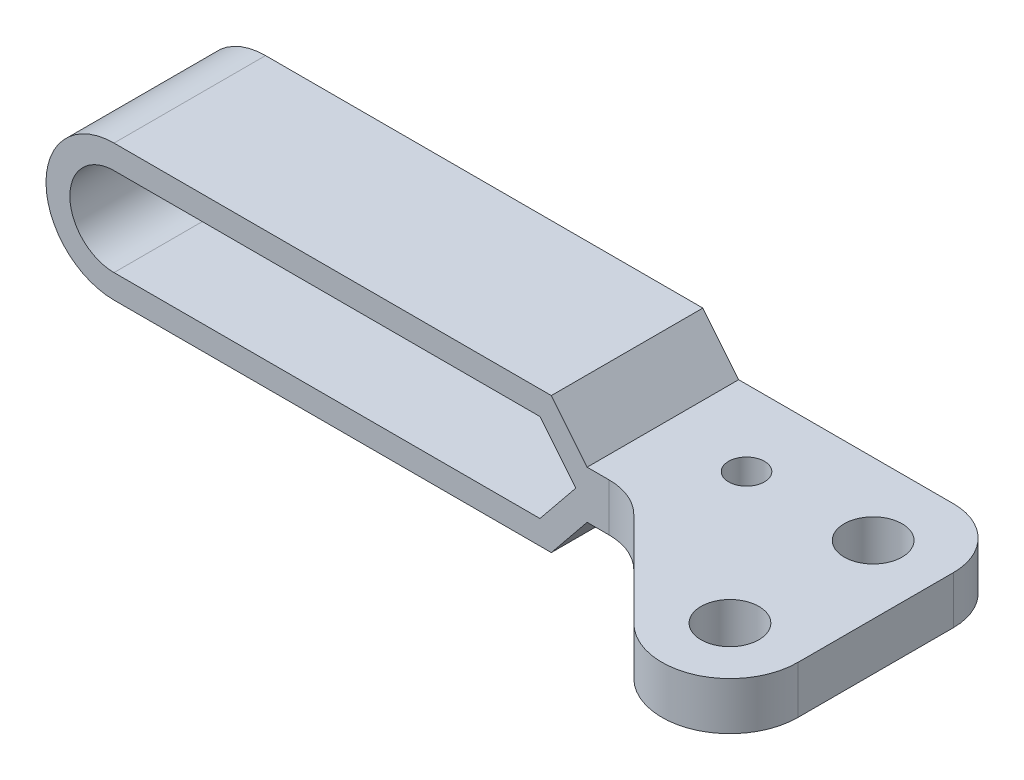
ISO-10303-21;
HEADER;
FILE_DESCRIPTION(('STEP AP214'),'2;1');
FILE_NAME('part.step','',(''),(''),'','','');
FILE_SCHEMA(('AUTOMOTIVE_DESIGN { 1 0 10303 214 1 1 1 1 }'));
ENDSEC;
DATA;
#1=APPLICATION_CONTEXT('core data for automotive mechanical design processes');
#2=APPLICATION_PROTOCOL_DEFINITION('international standard','automotive_design',2000,#1);
#3=PRODUCT_CONTEXT('',#1,'mechanical');
#4=PRODUCT('Part','Part','',(#3));
#5=PRODUCT_RELATED_PRODUCT_CATEGORY('part','',(#4));
#6=PRODUCT_DEFINITION_FORMATION('','',#4);
#7=PRODUCT_DEFINITION_CONTEXT('part definition',#1,'design');
#8=PRODUCT_DEFINITION('design','',#6,#7);
#9=PRODUCT_DEFINITION_SHAPE('','',#8);
#10=(LENGTH_UNIT() NAMED_UNIT(*) SI_UNIT(.MILLI.,.METRE.));
#11=(NAMED_UNIT(*) PLANE_ANGLE_UNIT() SI_UNIT($,.RADIAN.));
#12=(NAMED_UNIT(*) SI_UNIT($,.STERADIAN.) SOLID_ANGLE_UNIT());
#13=UNCERTAINTY_MEASURE_WITH_UNIT(LENGTH_MEASURE(1.E-05),#10,'distance_accuracy_value','');
#14=(GEOMETRIC_REPRESENTATION_CONTEXT(3) GLOBAL_UNCERTAINTY_ASSIGNED_CONTEXT((#13)) GLOBAL_UNIT_ASSIGNED_CONTEXT((#10,
#11,#12)) REPRESENTATION_CONTEXT('',''));
#15=CARTESIAN_POINT('',(0.,0.,0.));
#16=DIRECTION('',(0.,0.,1.));
#17=DIRECTION('',(1.,0.,0.));
#18=AXIS2_PLACEMENT_3D('',#15,#16,#17);
#19=CARTESIAN_POINT('',(-62.65,5.7,12.7));
#20=DIRECTION('',(0.,-1.,0.));
#21=DIRECTION('',(0.,0.,-1.));
#22=AXIS2_PLACEMENT_3D('',#19,#20,#21);
#23=PLANE('',#22);
#24=DIRECTION('',(0.,0.,-1.));
#25=VECTOR('',#24,1.);
#26=CARTESIAN_POINT('',(-26.,5.7,6.35));
#27=LINE('',#26,#25);
#28=CARTESIAN_POINT('',(-25.9999999933277,5.7,12.7));
#29=VERTEX_POINT('',#28);
#30=CARTESIAN_POINT('',(-26.,5.7,0.));
#31=VERTEX_POINT('',#30);
#32=EDGE_CURVE('E219',#29,#31,#27,.T.);
#33=ORIENTED_EDGE('',*,*,#32,.T.);
#34=DIRECTION('',(-1.,0.,0.));
#35=VECTOR('',#34,1.);
#36=CARTESIAN_POINT('',(-36.86505,5.7,0.));
#37=LINE('',#36,#35);
#38=CARTESIAN_POINT('',(-62.6499999994154,5.7,0.));
#39=VERTEX_POINT('',#38);
#40=EDGE_CURVE('E212',#31,#39,#37,.T.);
#41=ORIENTED_EDGE('',*,*,#40,.T.);
#42=DIRECTION('',(0.,0.,-1.));
#43=VECTOR('',#42,1.);
#44=CARTESIAN_POINT('',(-62.6499999988309,5.7,6.35));
#45=LINE('',#44,#43);
#46=CARTESIAN_POINT('',(-62.6499999994154,5.7,12.7));
#47=VERTEX_POINT('',#46);
#48=EDGE_CURVE('E237',#39,#47,#45,.F.);
#49=ORIENTED_EDGE('',*,*,#48,.T.);
#50=DIRECTION('',(-1.,0.,0.));
#51=VECTOR('',#50,1.);
#52=CARTESIAN_POINT('',(-44.897606303,5.7,12.7));
#53=LINE('',#52,#51);
#54=EDGE_CURVE('E183',#29,#47,#53,.T.);
#55=ORIENTED_EDGE('',*,*,#54,.F.);
#56=EDGE_LOOP('',(#33,#41,#49,#55));
#57=FACE_BOUND('',#56,.T.);
#58=ADVANCED_FACE('F16',(#57),#23,.F.);
#59=CARTESIAN_POINT('',(-62.65,0.,12.7));
#60=DIRECTION('',(0.,0.,-1.));
#61=DIRECTION('',(-1.,0.,0.));
#62=AXIS2_PLACEMENT_3D('',#59,#60,#61);
#63=CYLINDRICAL_SURFACE('',#62,5.7);
#64=CARTESIAN_POINT('',(-62.65,0.,12.7));
#65=DIRECTION('',(0.,0.,-1.));
#66=DIRECTION('',(-1.,0.,0.));
#67=AXIS2_PLACEMENT_3D('',#64,#65,#66);
#68=CIRCLE('',#67,5.7);
#69=CARTESIAN_POINT('',(-62.65,-5.7,12.7));
#70=VERTEX_POINT('',#69);
#71=EDGE_CURVE('E182',#47,#70,#68,.F.);
#72=ORIENTED_EDGE('',*,*,#71,.F.);
#73=ORIENTED_EDGE('',*,*,#48,.F.);
#74=CARTESIAN_POINT('',(-62.65,0.,0.));
#75=DIRECTION('',(0.,0.,-1.));
#76=DIRECTION('',(-1.,0.,0.));
#77=AXIS2_PLACEMENT_3D('',#74,#75,#76);
#78=CIRCLE('',#77,5.7);
#79=CARTESIAN_POINT('',(-62.65,-5.7,0.));
#80=VERTEX_POINT('',#79);
#81=EDGE_CURVE('E209',#39,#80,#78,.F.);
#82=ORIENTED_EDGE('',*,*,#81,.T.);
#83=DIRECTION('',(0.,0.,1.));
#84=VECTOR('',#83,1.);
#85=CARTESIAN_POINT('',(-62.65,-5.7,6.35));
#86=LINE('',#85,#84);
#87=EDGE_CURVE('E232',#80,#70,#86,.T.);
#88=ORIENTED_EDGE('',*,*,#87,.T.);
#89=EDGE_LOOP('',(#72,#73,#82,#88));
#90=FACE_BOUND('',#89,.T.);
#91=ADVANCED_FACE('F286',(#90),#63,.T.);
#92=CARTESIAN_POINT('',(-62.65,-5.7,0.));
#93=DIRECTION('',(0.,1.,0.));
#94=DIRECTION('',(0.,0.,1.));
#95=AXIS2_PLACEMENT_3D('',#92,#93,#94);
#96=PLANE('',#95);
#97=ORIENTED_EDGE('',*,*,#87,.F.);
#98=DIRECTION('',(1.,0.,0.));
#99=VECTOR('',#98,1.);
#100=CARTESIAN_POINT('',(-36.86505,-5.7,0.));
#101=LINE('',#100,#99);
#102=CARTESIAN_POINT('',(-26.0000000009042,-5.7,0.));
#103=VERTEX_POINT('',#102);
#104=EDGE_CURVE('E206',#80,#103,#101,.T.);
#105=ORIENTED_EDGE('',*,*,#104,.T.);
#106=DIRECTION('',(0.,0.,1.));
#107=VECTOR('',#106,1.);
#108=CARTESIAN_POINT('',(-26.,-5.7,6.35));
#109=LINE('',#108,#107);
#110=CARTESIAN_POINT('',(-25.9999999933277,-5.7,12.7));
#111=VERTEX_POINT('',#110);
#112=EDGE_CURVE('E195',#103,#111,#109,.T.);
#113=ORIENTED_EDGE('',*,*,#112,.T.);
#114=DIRECTION('',(1.,0.,0.));
#115=VECTOR('',#114,1.);
#116=CARTESIAN_POINT('',(-44.897606303,-5.7,12.7));
#117=LINE('',#116,#115);
#118=EDGE_CURVE('E179',#70,#111,#117,.T.);
#119=ORIENTED_EDGE('',*,*,#118,.F.);
#120=EDGE_LOOP('',(#97,#105,#113,#119));
#121=FACE_BOUND('',#120,.T.);
#122=ADVANCED_FACE('F291',(#121),#96,.F.);
#123=CARTESIAN_POINT('',(-62.65,3.7,0.));
#124=DIRECTION('',(0.,-1.,0.));
#125=DIRECTION('',(1.,0.,0.));
#126=AXIS2_PLACEMENT_3D('',#123,#124,#125);
#127=PLANE('',#126);
#128=DIRECTION('',(0.,0.,-1.));
#129=VECTOR('',#128,1.);
#130=CARTESIAN_POINT('',(-62.6499999992411,3.69999999999999,6.35));
#131=LINE('',#130,#129);
#132=CARTESIAN_POINT('',(-62.6499999996206,3.7000000028,0.));
#133=VERTEX_POINT('',#132);
#134=CARTESIAN_POINT('',(-62.6499999996206,3.7000000028,12.7));
#135=VERTEX_POINT('',#134);
#136=EDGE_CURVE('E216',#133,#135,#131,.F.);
#137=ORIENTED_EDGE('',*,*,#136,.F.);
#138=DIRECTION('',(1.,0.,0.));
#139=VECTOR('',#138,1.);
#140=CARTESIAN_POINT('',(-36.86505,3.7000000056,0.));
#141=LINE('',#140,#139);
#142=CARTESIAN_POINT('',(-26.9531903512703,3.7000000028,0.));
#143=VERTEX_POINT('',#142);
#144=EDGE_CURVE('E203',#133,#143,#141,.T.);
#145=ORIENTED_EDGE('',*,*,#144,.T.);
#146=DIRECTION('',(0.,0.,-1.));
#147=VECTOR('',#146,1.);
#148=CARTESIAN_POINT('',(-26.953190349,3.7,6.35));
#149=LINE('',#148,#147);
#150=CARTESIAN_POINT('',(-26.9531903580785,3.7000000042,12.7));
#151=VERTEX_POINT('',#150);
#152=EDGE_CURVE('E229',#151,#143,#149,.T.);
#153=ORIENTED_EDGE('',*,*,#152,.F.);
#154=DIRECTION('',(1.,0.,0.));
#155=VECTOR('',#154,1.);
#156=CARTESIAN_POINT('',(-44.897606303,3.7000000056,12.7));
#157=LINE('',#156,#155);
#158=EDGE_CURVE('E174',#135,#151,#157,.T.);
#159=ORIENTED_EDGE('',*,*,#158,.F.);
#160=EDGE_LOOP('',(#137,#145,#153,#159));
#161=FACE_BOUND('',#160,.T.);
#162=ADVANCED_FACE('F374',(#161),#127,.T.);
#163=CARTESIAN_POINT('',(-26.953190349,3.7,0.));
#164=DIRECTION('',(-0.776755748719504,-0.629801958421219,0.));
#165=DIRECTION('',(0.629801958421219,-0.776755748719504,0.));
#166=AXIS2_PLACEMENT_3D('',#163,#164,#165);
#167=PLANE('',#166);
#168=ORIENTED_EDGE('',*,*,#152,.T.);
#169=DIRECTION('',(0.629801958421219,-0.776755748719504,0.));
#170=VECTOR('',#169,1.);
#171=CARTESIAN_POINT('',(-26.953190349,3.7,0.));
#172=LINE('',#171,#170);
#173=CARTESIAN_POINT('',(-23.953190349,0.,0.));
#174=VERTEX_POINT('',#173);
#175=EDGE_CURVE('E205',#143,#174,#172,.T.);
#176=ORIENTED_EDGE('',*,*,#175,.T.);
#177=DIRECTION('',(0.,0.,-1.));
#178=VECTOR('',#177,1.);
#179=CARTESIAN_POINT('',(-23.953190349,0.,6.35));
#180=LINE('',#179,#178);
#181=CARTESIAN_POINT('',(-23.9531903435565,1.022902421868E-09,12.7));
#182=VERTEX_POINT('',#181);
#183=EDGE_CURVE('E226',#182,#174,#180,.T.);
#184=ORIENTED_EDGE('',*,*,#183,.F.);
#185=DIRECTION('',(0.629801961205317,-0.776755746462127,0.));
#186=VECTOR('',#185,1.);
#187=CARTESIAN_POINT('',(-26.953190367157,3.7000000056,12.7));
#188=LINE('',#187,#186);
#189=EDGE_CURVE('E177',#151,#182,#188,.T.);
#190=ORIENTED_EDGE('',*,*,#189,.F.);
#191=EDGE_LOOP('',(#168,#176,#184,#190));
#192=FACE_BOUND('',#191,.T.);
#193=ADVANCED_FACE('F377',(#192),#167,.T.);
#194=CARTESIAN_POINT('',(-23.953190349,0.,0.));
#195=DIRECTION('',(-0.776755748719504,0.629801958421219,0.));
#196=DIRECTION('',(-0.629801958421219,-0.776755748719504,0.));
#197=AXIS2_PLACEMENT_3D('',#194,#195,#196);
#198=PLANE('',#197);
#199=ORIENTED_EDGE('',*,*,#183,.T.);
#200=DIRECTION('',(-0.629801958421219,-0.776755748719504,0.));
#201=VECTOR('',#200,1.);
#202=CARTESIAN_POINT('',(-23.953190349,0.,0.));
#203=LINE('',#202,#201);
#204=CARTESIAN_POINT('',(-26.9531903512703,-3.7000000028,0.));
#205=VERTEX_POINT('',#204);
#206=EDGE_CURVE('E202',#174,#205,#203,.T.);
#207=ORIENTED_EDGE('',*,*,#206,.T.);
#208=DIRECTION('',(0.,0.,-1.));
#209=VECTOR('',#208,1.);
#210=CARTESIAN_POINT('',(-26.953190349,-3.7,6.35));
#211=LINE('',#210,#209);
#212=CARTESIAN_POINT('',(-26.9531903580785,-3.7000000042,12.7));
#213=VERTEX_POINT('',#212);
#214=EDGE_CURVE('E223',#213,#205,#211,.T.);
#215=ORIENTED_EDGE('',*,*,#214,.F.);
#216=DIRECTION('',(-0.629801961205317,-0.776755746462127,0.));
#217=VECTOR('',#216,1.);
#218=CARTESIAN_POINT('',(-23.9531903406362,0.,12.7));
#219=LINE('',#218,#217);
#220=EDGE_CURVE('E173',#182,#213,#219,.T.);
#221=ORIENTED_EDGE('',*,*,#220,.F.);
#222=EDGE_LOOP('',(#199,#207,#215,#221));
#223=FACE_BOUND('',#222,.T.);
#224=ADVANCED_FACE('F381',(#223),#198,.T.);
#225=CARTESIAN_POINT('',(-26.953190349,-3.7,0.));
#226=DIRECTION('',(0.,1.,0.));
#227=DIRECTION('',(-1.,0.,0.));
#228=AXIS2_PLACEMENT_3D('',#225,#226,#227);
#229=PLANE('',#228);
#230=ORIENTED_EDGE('',*,*,#214,.T.);
#231=DIRECTION('',(-1.,0.,0.));
#232=VECTOR('',#231,1.);
#233=CARTESIAN_POINT('',(-36.86505,-3.7000000056,0.));
#234=LINE('',#233,#232);
#235=CARTESIAN_POINT('',(-62.6499999992883,-3.7000000028,0.));
#236=VERTEX_POINT('',#235);
#237=EDGE_CURVE('E199',#205,#236,#234,.T.);
#238=ORIENTED_EDGE('',*,*,#237,.T.);
#239=DIRECTION('',(0.,0.,1.));
#240=VECTOR('',#239,1.);
#241=CARTESIAN_POINT('',(-62.6499999985766,-3.69999999999999,6.35));
#242=LINE('',#241,#240);
#243=CARTESIAN_POINT('',(-62.6499999992883,-3.7000000028,12.7));
#244=VERTEX_POINT('',#243);
#245=EDGE_CURVE('E220',#244,#236,#242,.F.);
#246=ORIENTED_EDGE('',*,*,#245,.F.);
#247=DIRECTION('',(-1.,0.,0.));
#248=VECTOR('',#247,1.);
#249=CARTESIAN_POINT('',(-44.897606303,-3.7000000056,12.7));
#250=LINE('',#249,#248);
#251=EDGE_CURVE('E170',#213,#244,#250,.T.);
#252=ORIENTED_EDGE('',*,*,#251,.F.);
#253=EDGE_LOOP('',(#230,#238,#246,#252));
#254=FACE_BOUND('',#253,.T.);
#255=ADVANCED_FACE('F339',(#254),#229,.T.);
#256=CARTESIAN_POINT('',(-62.65,0.,12.7));
#257=DIRECTION('',(0.,0.,-1.));
#258=DIRECTION('',(-1.,0.,0.));
#259=AXIS2_PLACEMENT_3D('',#256,#257,#258);
#260=CYLINDRICAL_SURFACE('',#259,3.69999999999999);
#261=CARTESIAN_POINT('',(-62.65,0.,0.));
#262=DIRECTION('',(0.,0.,-1.));
#263=DIRECTION('',(-1.,0.,0.));
#264=AXIS2_PLACEMENT_3D('',#261,#262,#263);
#265=CIRCLE('',#264,3.69999999999999);
#266=EDGE_CURVE('E196',#236,#133,#265,.T.);
#267=ORIENTED_EDGE('',*,*,#266,.T.);
#268=ORIENTED_EDGE('',*,*,#136,.T.);
#269=CARTESIAN_POINT('',(-62.65,0.,12.7));
#270=DIRECTION('',(0.,0.,-1.));
#271=DIRECTION('',(-1.,0.,0.));
#272=AXIS2_PLACEMENT_3D('',#269,#270,#271);
#273=CIRCLE('',#272,3.69999999999999);
#274=EDGE_CURVE('E169',#244,#135,#273,.T.);
#275=ORIENTED_EDGE('',*,*,#274,.F.);
#276=ORIENTED_EDGE('',*,*,#245,.T.);
#277=EDGE_LOOP('',(#267,#268,#275,#276));
#278=FACE_BOUND('',#277,.T.);
#279=ADVANCED_FACE('F330',(#278),#260,.F.);
#280=CARTESIAN_POINT('',(-26.,5.7,0.));
#281=DIRECTION('',(-0.776755748719503,-0.62980195842122,0.));
#282=DIRECTION('',(0.62980195842122,-0.776755748719503,0.));
#283=AXIS2_PLACEMENT_3D('',#280,#281,#282);
#284=PLANE('',#283);
#285=DIRECTION('',(0.,0.,-1.));
#286=VECTOR('',#285,1.);
#287=CARTESIAN_POINT('',(-23.,2.,11.93619));
#288=LINE('',#287,#286);
#289=CARTESIAN_POINT('',(-23.0000000060731,2.,12.6999999996446));
#290=VERTEX_POINT('',#289);
#291=CARTESIAN_POINT('',(-23.,2.,0.));
#292=VERTEX_POINT('',#291);
#293=EDGE_CURVE('E109',#290,#292,#288,.T.);
#294=ORIENTED_EDGE('',*,*,#293,.T.);
#295=DIRECTION('',(0.62980195842122,-0.776755748719503,0.));
#296=VECTOR('',#295,1.);
#297=CARTESIAN_POINT('',(-26.,5.7,0.));
#298=LINE('',#297,#296);
#299=EDGE_CURVE('E20',#292,#31,#298,.F.);
#300=ORIENTED_EDGE('',*,*,#299,.T.);
#301=ORIENTED_EDGE('',*,*,#32,.F.);
#302=DIRECTION('',(-0.629801955192465,0.776755751337413,0.));
#303=VECTOR('',#302,1.);
#304=CARTESIAN_POINT('',(-23.0000000076056,1.9999999944,12.7));
#305=LINE('',#304,#303);
#306=EDGE_CURVE('E186',#290,#29,#305,.T.);
#307=ORIENTED_EDGE('',*,*,#306,.F.);
#308=EDGE_LOOP('',(#294,#300,#301,#307));
#309=FACE_BOUND('',#308,.T.);
#310=ADVANCED_FACE('F328',(#309),#284,.F.);
#311=CARTESIAN_POINT('',(-68.7301,-5.7,0.));
#312=DIRECTION('',(0.,0.,1.));
#313=DIRECTION('',(1.,0.,0.));
#314=AXIS2_PLACEMENT_3D('',#311,#312,#313);
#315=PLANE('',#314);
#316=ORIENTED_EDGE('',*,*,#266,.F.);
#317=ORIENTED_EDGE('',*,*,#237,.F.);
#318=ORIENTED_EDGE('',*,*,#206,.F.);
#319=ORIENTED_EDGE('',*,*,#175,.F.);
#320=ORIENTED_EDGE('',*,*,#144,.F.);
#321=EDGE_LOOP('',(#316,#317,#318,#319,#320));
#322=FACE_BOUND('',#321,.T.);
#323=DIRECTION('',(-1.,0.,0.));
#324=VECTOR('',#323,1.);
#325=CARTESIAN_POINT('',(-11.5,-2.,0.));
#326=LINE('',#325,#324);
#327=CARTESIAN_POINT('',(-5.00000000102552,-2.,0.));
#328=VERTEX_POINT('',#327);
#329=CARTESIAN_POINT('',(-23.,-2.,0.));
#330=VERTEX_POINT('',#329);
#331=EDGE_CURVE('E164',#328,#330,#326,.T.);
#332=ORIENTED_EDGE('',*,*,#331,.T.);
#333=DIRECTION('',(-0.62980195842122,-0.776755748719503,0.));
#334=VECTOR('',#333,1.);
#335=CARTESIAN_POINT('',(-24.5,-3.85,0.));
#336=LINE('',#335,#334);
#337=EDGE_CURVE('E192',#330,#103,#336,.T.);
#338=ORIENTED_EDGE('',*,*,#337,.T.);
#339=ORIENTED_EDGE('',*,*,#104,.F.);
#340=ORIENTED_EDGE('',*,*,#81,.F.);
#341=ORIENTED_EDGE('',*,*,#40,.F.);
#342=ORIENTED_EDGE('',*,*,#299,.F.);
#343=DIRECTION('',(1.,0.,0.));
#344=VECTOR('',#343,1.);
#345=CARTESIAN_POINT('',(-11.5,2.,0.));
#346=LINE('',#345,#344);
#347=CARTESIAN_POINT('',(-5.00000000102552,2.,0.));
#348=VERTEX_POINT('',#347);
#349=EDGE_CURVE('E117',#292,#348,#346,.T.);
#350=ORIENTED_EDGE('',*,*,#349,.T.);
#351=DIRECTION('',(0.,1.,0.));
#352=VECTOR('',#351,1.);
#353=CARTESIAN_POINT('',(-5.00000000205103,0.,0.));
#354=LINE('',#353,#352);
#355=EDGE_CURVE('E141',#348,#328,#354,.F.);
#356=ORIENTED_EDGE('',*,*,#355,.T.);
#357=EDGE_LOOP('',(#332,#338,#339,#340,#341,#342,#350,#356));
#358=FACE_BOUND('',#357,.T.);
#359=ADVANCED_FACE('F293',(#322,#358),#315,.F.);
#360=CARTESIAN_POINT('',(-23.,-2.,0.));
#361=DIRECTION('',(-0.776755748719503,0.62980195842122,0.));
#362=DIRECTION('',(-0.62980195842122,-0.776755748719503,0.));
#363=AXIS2_PLACEMENT_3D('',#360,#361,#362);
#364=PLANE('',#363);
#365=ORIENTED_EDGE('',*,*,#112,.F.);
#366=ORIENTED_EDGE('',*,*,#337,.F.);
#367=DIRECTION('',(0.,0.,1.));
#368=VECTOR('',#367,1.);
#369=CARTESIAN_POINT('',(-23.,-2.,11.93619));
#370=LINE('',#369,#368);
#371=CARTESIAN_POINT('',(-23.0000000060731,-2.,12.6999999996446));
#372=VERTEX_POINT('',#371);
#373=EDGE_CURVE('E187',#330,#372,#370,.T.);
#374=ORIENTED_EDGE('',*,*,#373,.T.);
#375=DIRECTION('',(0.629801955192465,0.776755751337413,0.));
#376=VECTOR('',#375,1.);
#377=CARTESIAN_POINT('',(-25.9999999866553,-5.7,12.7));
#378=LINE('',#377,#376);
#379=EDGE_CURVE('E178',#111,#372,#378,.T.);
#380=ORIENTED_EDGE('',*,*,#379,.F.);
#381=EDGE_LOOP('',(#365,#366,#374,#380));
#382=FACE_BOUND('',#381,.T.);
#383=ADVANCED_FACE('F301',(#382),#364,.F.);
#384=CARTESIAN_POINT('',(-68.633127489,-5.7,12.7));
#385=DIRECTION('',(0.,0.,1.));
#386=DIRECTION('',(1.,0.,0.));
#387=AXIS2_PLACEMENT_3D('',#384,#385,#386);
#388=PLANE('',#387);
#389=ORIENTED_EDGE('',*,*,#251,.T.);
#390=ORIENTED_EDGE('',*,*,#274,.T.);
#391=ORIENTED_EDGE('',*,*,#158,.T.);
#392=ORIENTED_EDGE('',*,*,#189,.T.);
#393=ORIENTED_EDGE('',*,*,#220,.T.);
#394=EDGE_LOOP('',(#389,#390,#391,#392,#393));
#395=FACE_BOUND('',#394,.T.);
#396=DIRECTION('',(1.,0.,0.));
#397=VECTOR('',#396,1.);
#398=CARTESIAN_POINT('',(-11.5,-2.,12.6999999995261));
#399=LINE('',#398,#397);
#400=CARTESIAN_POINT('',(-21.1620851180255,-2.,12.6999999997631));
#401=VERTEX_POINT('',#400);
#402=EDGE_CURVE('E189',#372,#401,#399,.T.);
#403=ORIENTED_EDGE('',*,*,#402,.T.);
#404=DIRECTION('',(0.,1.,0.));
#405=VECTOR('',#404,1.);
#406=CARTESIAN_POINT('',(-21.162085119051,0.,12.7));
#407=LINE('',#406,#405);
#408=CARTESIAN_POINT('',(-21.1620851180255,2.,12.6999999997631));
#409=VERTEX_POINT('',#408);
#410=EDGE_CURVE('E161',#409,#401,#407,.F.);
#411=ORIENTED_EDGE('',*,*,#410,.F.);
#412=DIRECTION('',(-1.,0.,0.));
#413=VECTOR('',#412,1.);
#414=CARTESIAN_POINT('',(-11.5,2.,12.6999999995261));
#415=LINE('',#414,#413);
#416=EDGE_CURVE('E159',#409,#290,#415,.T.);
#417=ORIENTED_EDGE('',*,*,#416,.T.);
#418=ORIENTED_EDGE('',*,*,#306,.T.);
#419=ORIENTED_EDGE('',*,*,#54,.T.);
#420=ORIENTED_EDGE('',*,*,#71,.T.);
#421=ORIENTED_EDGE('',*,*,#118,.T.);
#422=ORIENTED_EDGE('',*,*,#379,.T.);
#423=EDGE_LOOP('',(#403,#411,#417,#418,#419,#420,#421,#422));
#424=FACE_BOUND('',#423,.T.);
#425=ADVANCED_FACE('F305',(#395,#424),#388,.T.);
#426=CARTESIAN_POINT('',(-21.162085117,-2.,17.7));
#427=DIRECTION('',(0.,1.,0.));
#428=DIRECTION('',(0.,0.,1.));
#429=AXIS2_PLACEMENT_3D('',#426,#427,#428);
#430=CYLINDRICAL_SURFACE('',#429,5.);
#431=CARTESIAN_POINT('',(-21.162085117,-2.,17.7));
#432=DIRECTION('',(0.,1.,0.));
#433=DIRECTION('',(0.,0.,1.));
#434=AXIS2_PLACEMENT_3D('',#431,#432,#433);
#435=CIRCLE('',#434,5.);
#436=CARTESIAN_POINT('',(-17.6265512108881,-2.,14.1644660941119));
#437=VERTEX_POINT('',#436);
#438=EDGE_CURVE('E256',#401,#437,#435,.F.);
#439=ORIENTED_EDGE('',*,*,#438,.T.);
#440=DIRECTION('',(0.,-1.,0.));
#441=VECTOR('',#440,1.);
#442=CARTESIAN_POINT('',(-17.626551211,0.,14.164466094));
#443=LINE('',#442,#441);
#444=CARTESIAN_POINT('',(-17.6265512108881,2.,14.1644660941119));
#445=VERTEX_POINT('',#444);
#446=EDGE_CURVE('E140',#445,#437,#443,.T.);
#447=ORIENTED_EDGE('',*,*,#446,.F.);
#448=CARTESIAN_POINT('',(-21.162085117,2.,17.7));
#449=DIRECTION('',(0.,1.,0.));
#450=DIRECTION('',(0.,0.,1.));
#451=AXIS2_PLACEMENT_3D('',#448,#449,#450);
#452=CIRCLE('',#451,5.);
#453=EDGE_CURVE('E153',#445,#409,#452,.T.);
#454=ORIENTED_EDGE('',*,*,#453,.T.);
#455=ORIENTED_EDGE('',*,*,#410,.T.);
#456=EDGE_LOOP('',(#439,#447,#454,#455));
#457=FACE_BOUND('',#456,.T.);
#458=ADVANCED_FACE('F322',(#457),#430,.F.);
#459=CARTESIAN_POINT('',(0.,2.,5.));
#460=DIRECTION('',(-1.,0.,0.));
#461=DIRECTION('',(0.,-1.,0.));
#462=AXIS2_PLACEMENT_3D('',#459,#460,#461);
#463=PLANE('',#462);
#464=DIRECTION('',(0.,-1.,0.));
#465=VECTOR('',#464,1.);
#466=CARTESIAN_POINT('',(0.,0.,4.99999999897448));
#467=LINE('',#466,#465);
#468=CARTESIAN_POINT('',(0.,-2.,4.99999999948724));
#469=VERTEX_POINT('',#468);
#470=CARTESIAN_POINT('',(0.,2.,4.99999999948724));
#471=VERTEX_POINT('',#470);
#472=EDGE_CURVE('E128',#469,#471,#467,.F.);
#473=ORIENTED_EDGE('',*,*,#472,.T.);
#474=DIRECTION('',(0.,0.,1.));
#475=VECTOR('',#474,1.);
#476=CARTESIAN_POINT('',(0.,2.,11.93619));
#477=LINE('',#476,#475);
#478=CARTESIAN_POINT('',(0.,2.,18.0299999994155));
#479=VERTEX_POINT('',#478);
#480=EDGE_CURVE('E133',#471,#479,#477,.T.);
#481=ORIENTED_EDGE('',*,*,#480,.T.);
#482=DIRECTION('',(0.,1.,0.));
#483=VECTOR('',#482,1.);
#484=CARTESIAN_POINT('',(0.,0.,18.0299999988309));
#485=LINE('',#484,#483);
#486=CARTESIAN_POINT('',(0.,-2.,18.0299999994155));
#487=VERTEX_POINT('',#486);
#488=EDGE_CURVE('E163',#479,#487,#485,.F.);
#489=ORIENTED_EDGE('',*,*,#488,.T.);
#490=DIRECTION('',(0.,0.,-1.));
#491=VECTOR('',#490,1.);
#492=CARTESIAN_POINT('',(0.,-2.,11.93619));
#493=LINE('',#492,#491);
#494=EDGE_CURVE('E136',#487,#469,#493,.T.);
#495=ORIENTED_EDGE('',*,*,#494,.T.);
#496=EDGE_LOOP('',(#473,#481,#489,#495));
#497=FACE_BOUND('',#496,.T.);
#498=ADVANCED_FACE('F130',(#497),#463,.F.);
#499=CARTESIAN_POINT('',(-5.,-2.,5.));
#500=DIRECTION('',(0.,1.,0.));
#501=DIRECTION('',(0.,0.,1.));
#502=AXIS2_PLACEMENT_3D('',#499,#500,#501);
#503=CYLINDRICAL_SURFACE('',#502,5.);
#504=ORIENTED_EDGE('',*,*,#472,.F.);
#505=CARTESIAN_POINT('',(-5.,-2.,5.));
#506=DIRECTION('',(0.,1.,0.));
#507=DIRECTION('',(0.,0.,1.));
#508=AXIS2_PLACEMENT_3D('',#505,#506,#507);
#509=CIRCLE('',#508,5.);
#510=EDGE_CURVE('E252',#469,#328,#509,.T.);
#511=ORIENTED_EDGE('',*,*,#510,.T.);
#512=ORIENTED_EDGE('',*,*,#355,.F.);
#513=CARTESIAN_POINT('',(-5.,2.,5.));
#514=DIRECTION('',(0.,1.,0.));
#515=DIRECTION('',(0.,0.,1.));
#516=AXIS2_PLACEMENT_3D('',#513,#514,#515);
#517=CIRCLE('',#516,5.);
#518=EDGE_CURVE('E144',#348,#471,#517,.F.);
#519=ORIENTED_EDGE('',*,*,#518,.T.);
#520=EDGE_LOOP('',(#504,#511,#512,#519));
#521=FACE_BOUND('',#520,.T.);
#522=ADVANCED_FACE('F145',(#521),#503,.T.);
#523=CARTESIAN_POINT('',(-5.7,-2.,6.03));
#524=DIRECTION('',(0.,1.,0.));
#525=DIRECTION('',(0.,0.,1.));
#526=AXIS2_PLACEMENT_3D('',#523,#524,#525);
#527=CYLINDRICAL_SURFACE('',#526,2.425);
#528=CARTESIAN_POINT('',(-5.7,-2.,6.03));
#529=DIRECTION('',(0.,1.,0.));
#530=DIRECTION('',(0.,0.,1.));
#531=AXIS2_PLACEMENT_3D('',#528,#529,#530);
#532=CIRCLE('',#531,2.425);
#533=CARTESIAN_POINT('',(-5.7,-2.,8.455));
#534=VERTEX_POINT('',#533);
#535=EDGE_CURVE('E249',#534,#534,#532,.F.);
#536=ORIENTED_EDGE('',*,*,#535,.T.);
#537=EDGE_LOOP('',(#536));
#538=FACE_BOUND('',#537,.T.);
#539=CARTESIAN_POINT('',(-5.7,2.,6.03));
#540=DIRECTION('',(0.,1.,0.));
#541=DIRECTION('',(0.,0.,1.));
#542=AXIS2_PLACEMENT_3D('',#539,#540,#541);
#543=CIRCLE('',#542,2.425);
#544=CARTESIAN_POINT('',(-5.7,2.,8.455));
#545=VERTEX_POINT('',#544);
#546=EDGE_CURVE('E147',#545,#545,#543,.T.);
#547=ORIENTED_EDGE('',*,*,#546,.T.);
#548=EDGE_LOOP('',(#547));
#549=FACE_BOUND('',#548,.T.);
#550=ADVANCED_FACE('F359',(#538,#549),#527,.F.);
#551=CARTESIAN_POINT('',(-5.7,-2.,18.03));
#552=DIRECTION('',(0.,1.,0.));
#553=DIRECTION('',(0.,0.,1.));
#554=AXIS2_PLACEMENT_3D('',#551,#552,#553);
#555=CYLINDRICAL_SURFACE('',#554,2.425);
#556=CARTESIAN_POINT('',(-5.7,-2.,18.03));
#557=DIRECTION('',(0.,1.,0.));
#558=DIRECTION('',(0.,0.,1.));
#559=AXIS2_PLACEMENT_3D('',#556,#557,#558);
#560=CIRCLE('',#559,2.425);
#561=CARTESIAN_POINT('',(-5.7,-2.,20.455));
#562=VERTEX_POINT('',#561);
#563=EDGE_CURVE('E246',#562,#562,#560,.F.);
#564=ORIENTED_EDGE('',*,*,#563,.T.);
#565=EDGE_LOOP('',(#564));
#566=FACE_BOUND('',#565,.T.);
#567=CARTESIAN_POINT('',(-5.7,2.,18.03));
#568=DIRECTION('',(0.,1.,0.));
#569=DIRECTION('',(0.,0.,1.));
#570=AXIS2_PLACEMENT_3D('',#567,#568,#569);
#571=CIRCLE('',#570,2.425);
#572=CARTESIAN_POINT('',(-5.7,2.,20.455));
#573=VERTEX_POINT('',#572);
#574=EDGE_CURVE('E261',#573,#573,#571,.T.);
#575=ORIENTED_EDGE('',*,*,#574,.T.);
#576=EDGE_LOOP('',(#575));
#577=FACE_BOUND('',#576,.T.);
#578=ADVANCED_FACE('F355',(#566,#577),#555,.F.);
#579=CARTESIAN_POINT('',(-16.,-2.,6.34));
#580=DIRECTION('',(0.,1.,0.));
#581=DIRECTION('',(0.,0.,1.));
#582=AXIS2_PLACEMENT_3D('',#579,#580,#581);
#583=CYLINDRICAL_SURFACE('',#582,1.5);
#584=CARTESIAN_POINT('',(-16.,-2.,6.34));
#585=DIRECTION('',(0.,1.,0.));
#586=DIRECTION('',(0.,0.,1.));
#587=AXIS2_PLACEMENT_3D('',#584,#585,#586);
#588=CIRCLE('',#587,1.5);
#589=CARTESIAN_POINT('',(-16.,-2.,7.84));
#590=VERTEX_POINT('',#589);
#591=EDGE_CURVE('E243',#590,#590,#588,.F.);
#592=ORIENTED_EDGE('',*,*,#591,.T.);
#593=EDGE_LOOP('',(#592));
#594=FACE_BOUND('',#593,.T.);
#595=CARTESIAN_POINT('',(-16.,2.,6.34));
#596=DIRECTION('',(0.,1.,0.));
#597=DIRECTION('',(0.,0.,1.));
#598=AXIS2_PLACEMENT_3D('',#595,#596,#597);
#599=CIRCLE('',#598,1.5);
#600=CARTESIAN_POINT('',(-16.,2.,7.84));
#601=VERTEX_POINT('',#600);
#602=EDGE_CURVE('E165',#601,#601,#599,.T.);
#603=ORIENTED_EDGE('',*,*,#602,.T.);
#604=EDGE_LOOP('',(#603));
#605=FACE_BOUND('',#604,.T.);
#606=ADVANCED_FACE('F352',(#594,#605),#583,.F.);
#607=CARTESIAN_POINT('',(-17.626551211,-2.,14.164466094));
#608=DIRECTION('',(-0.707106781231323,0.,0.707106781141772));
#609=DIRECTION('',(0.707106781141772,0.,0.707106781231323));
#610=AXIS2_PLACEMENT_3D('',#607,#608,#609);
#611=PLANE('',#610);
#612=DIRECTION('',(0.707106781141772,0.,0.707106781231323));
#613=VECTOR('',#612,1.);
#614=CARTESIAN_POINT('',(-17.626551211,-2.,14.164466094));
#615=LINE('',#614,#613);
#616=CARTESIAN_POINT('',(-9.73050865257022,-2.,22.0605086531931));
#617=VERTEX_POINT('',#616);
#618=EDGE_CURVE('E254',#437,#617,#615,.T.);
#619=ORIENTED_EDGE('',*,*,#618,.T.);
#620=DIRECTION('',(0.,-1.,0.));
#621=VECTOR('',#620,1.);
#622=CARTESIAN_POINT('',(-9.73050865188522,0.,22.0605086536414));
#623=LINE('',#622,#621);
#624=CARTESIAN_POINT('',(-9.73050865257022,2.,22.0605086531931));
#625=VERTEX_POINT('',#624);
#626=EDGE_CURVE('E35',#617,#625,#623,.F.);
#627=ORIENTED_EDGE('',*,*,#626,.T.);
#628=DIRECTION('',(0.707106781141772,0.,0.707106781231323));
#629=VECTOR('',#628,1.);
#630=CARTESIAN_POINT('',(-17.626551211,2.,14.164466094));
#631=LINE('',#630,#629);
#632=EDGE_CURVE('E151',#625,#445,#631,.F.);
#633=ORIENTED_EDGE('',*,*,#632,.T.);
#634=ORIENTED_EDGE('',*,*,#446,.T.);
#635=EDGE_LOOP('',(#619,#627,#633,#634));
#636=FACE_BOUND('',#635,.T.);
#637=ADVANCED_FACE('F327',(#636),#611,.T.);
#638=CARTESIAN_POINT('',(-23.,2.,0.));
#639=DIRECTION('',(0.,-1.,0.));
#640=DIRECTION('',(1.,0.,0.));
#641=AXIS2_PLACEMENT_3D('',#638,#639,#640);
#642=PLANE('',#641);
#643=ORIENTED_EDGE('',*,*,#602,.F.);
#644=EDGE_LOOP('',(#643));
#645=FACE_BOUND('',#644,.T.);
#646=ORIENTED_EDGE('',*,*,#574,.F.);
#647=EDGE_LOOP('',(#646));
#648=FACE_BOUND('',#647,.T.);
#649=ORIENTED_EDGE('',*,*,#546,.F.);
#650=EDGE_LOOP('',(#649));
#651=FACE_BOUND('',#650,.T.);
#652=ORIENTED_EDGE('',*,*,#349,.F.);
#653=ORIENTED_EDGE('',*,*,#293,.F.);
#654=ORIENTED_EDGE('',*,*,#416,.F.);
#655=ORIENTED_EDGE('',*,*,#453,.F.);
#656=ORIENTED_EDGE('',*,*,#632,.F.);
#657=CARTESIAN_POINT('',(-5.7,2.,18.03));
#658=DIRECTION('',(0.,1.,0.));
#659=DIRECTION('',(0.,0.,1.));
#660=AXIS2_PLACEMENT_3D('',#657,#658,#659);
#661=CIRCLE('',#660,5.7);
#662=EDGE_CURVE('E26',#625,#479,#661,.T.);
#663=ORIENTED_EDGE('',*,*,#662,.T.);
#664=ORIENTED_EDGE('',*,*,#480,.F.);
#665=ORIENTED_EDGE('',*,*,#518,.F.);
#666=EDGE_LOOP('',(#652,#653,#654,#655,#656,#663,#664,#665));
#667=FACE_BOUND('',#666,.T.);
#668=ADVANCED_FACE('F149',(#645,#648,#651,#667),#642,.F.);
#669=CARTESIAN_POINT('',(0.,-2.,0.));
#670=DIRECTION('',(0.,1.,0.));
#671=DIRECTION('',(-1.,0.,0.));
#672=AXIS2_PLACEMENT_3D('',#669,#670,#671);
#673=PLANE('',#672);
#674=ORIENTED_EDGE('',*,*,#591,.F.);
#675=EDGE_LOOP('',(#674));
#676=FACE_BOUND('',#675,.T.);
#677=ORIENTED_EDGE('',*,*,#563,.F.);
#678=EDGE_LOOP('',(#677));
#679=FACE_BOUND('',#678,.T.);
#680=ORIENTED_EDGE('',*,*,#535,.F.);
#681=EDGE_LOOP('',(#680));
#682=FACE_BOUND('',#681,.T.);
#683=ORIENTED_EDGE('',*,*,#494,.F.);
#684=CARTESIAN_POINT('',(-5.7,-2.,18.03));
#685=DIRECTION('',(0.,1.,0.));
#686=DIRECTION('',(0.,0.,1.));
#687=AXIS2_PLACEMENT_3D('',#684,#685,#686);
#688=CIRCLE('',#687,5.7);
#689=EDGE_CURVE('E11',#487,#617,#688,.F.);
#690=ORIENTED_EDGE('',*,*,#689,.T.);
#691=ORIENTED_EDGE('',*,*,#618,.F.);
#692=ORIENTED_EDGE('',*,*,#438,.F.);
#693=ORIENTED_EDGE('',*,*,#402,.F.);
#694=ORIENTED_EDGE('',*,*,#373,.F.);
#695=ORIENTED_EDGE('',*,*,#331,.F.);
#696=ORIENTED_EDGE('',*,*,#510,.F.);
#697=EDGE_LOOP('',(#683,#690,#691,#692,#693,#694,#695,#696));
#698=FACE_BOUND('',#697,.T.);
#699=ADVANCED_FACE('F18',(#676,#679,#682,#698),#673,.F.);
#700=CARTESIAN_POINT('',(-5.7,-2.,18.03));
#701=DIRECTION('',(0.,1.,0.));
#702=DIRECTION('',(0.,0.,1.));
#703=AXIS2_PLACEMENT_3D('',#700,#701,#702);
#704=CYLINDRICAL_SURFACE('',#703,5.7);
#705=ORIENTED_EDGE('',*,*,#689,.F.);
#706=ORIENTED_EDGE('',*,*,#488,.F.);
#707=ORIENTED_EDGE('',*,*,#662,.F.);
#708=ORIENTED_EDGE('',*,*,#626,.F.);
#709=EDGE_LOOP('',(#705,#706,#707,#708));
#710=FACE_BOUND('',#709,.T.);
#711=ADVANCED_FACE('F343',(#710),#704,.T.);
#712=CLOSED_SHELL('',(#58,#91,#122,#162,#193,#224,#255,#279,#310,#359,#383,#425,#458,#498,#522,
#550,#578,#606,#637,#668,#699,#711));
#713=MANIFOLD_SOLID_BREP('B1',#712);
#714=ADVANCED_BREP_SHAPE_REPRESENTATION('',(#18,#713),#14);
#715=SHAPE_DEFINITION_REPRESENTATION(#9,#714);
ENDSEC;
END-ISO-10303-21;
